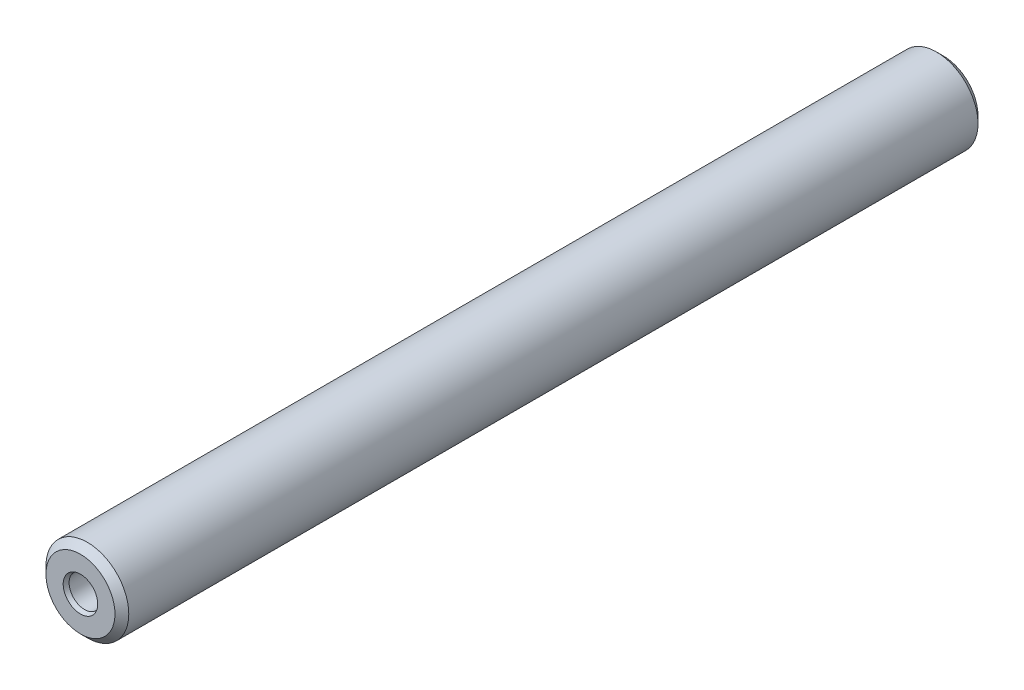
ISO-10303-21;
HEADER;
FILE_DESCRIPTION(('STEP AP214'),'2;1');
FILE_NAME('part.step','',(''),(''),'','','');
FILE_SCHEMA(('AUTOMOTIVE_DESIGN { 1 0 10303 214 1 1 1 1 }'));
ENDSEC;
DATA;
#1=APPLICATION_CONTEXT('core data for automotive mechanical design processes');
#2=APPLICATION_PROTOCOL_DEFINITION('international standard','automotive_design',2000,#1);
#3=PRODUCT_CONTEXT('',#1,'mechanical');
#4=PRODUCT('Part','Part','',(#3));
#5=PRODUCT_RELATED_PRODUCT_CATEGORY('part','',(#4));
#6=PRODUCT_DEFINITION_FORMATION('','',#4);
#7=PRODUCT_DEFINITION_CONTEXT('part definition',#1,'design');
#8=PRODUCT_DEFINITION('design','',#6,#7);
#9=PRODUCT_DEFINITION_SHAPE('','',#8);
#10=(LENGTH_UNIT() NAMED_UNIT(*) SI_UNIT(.MILLI.,.METRE.));
#11=(NAMED_UNIT(*) PLANE_ANGLE_UNIT() SI_UNIT($,.RADIAN.));
#12=(NAMED_UNIT(*) SI_UNIT($,.STERADIAN.) SOLID_ANGLE_UNIT());
#13=UNCERTAINTY_MEASURE_WITH_UNIT(LENGTH_MEASURE(1.E-05),#10,'distance_accuracy_value','');
#14=(GEOMETRIC_REPRESENTATION_CONTEXT(3) GLOBAL_UNCERTAINTY_ASSIGNED_CONTEXT((#13)) GLOBAL_UNIT_ASSIGNED_CONTEXT((#10,
#11,#12)) REPRESENTATION_CONTEXT('',''));
#15=CARTESIAN_POINT('',(0.,0.,0.));
#16=DIRECTION('',(0.,0.,1.));
#17=DIRECTION('',(1.,0.,0.));
#18=AXIS2_PLACEMENT_3D('',#15,#16,#17);
#19=CARTESIAN_POINT('',(0.,0.,125.));
#20=DIRECTION('',(0.,0.,-1.));
#21=DIRECTION('',(-1.,0.,0.));
#22=AXIS2_PLACEMENT_3D('',#19,#20,#21);
#23=CYLINDRICAL_SURFACE('',#22,6.00000000000001);
#24=CARTESIAN_POINT('',(0.,0.,0.999999999999987));
#25=DIRECTION('',(0.,0.,1.));
#26=DIRECTION('',(1.,0.,0.));
#27=AXIS2_PLACEMENT_3D('',#24,#25,#26);
#28=CIRCLE('',#27,6.00000000000001);
#29=CARTESIAN_POINT('',(6.00000000000001,0.,0.999999999999987));
#30=VERTEX_POINT('',#29);
#31=EDGE_CURVE('E77',#30,#30,#28,.T.);
#32=ORIENTED_EDGE('',*,*,#31,.T.);
#33=EDGE_LOOP('',(#32));
#34=FACE_BOUND('',#33,.T.);
#35=CARTESIAN_POINT('',(0.,0.,124.));
#36=DIRECTION('',(0.,0.,1.));
#37=DIRECTION('',(1.,0.,0.));
#38=AXIS2_PLACEMENT_3D('',#35,#36,#37);
#39=CIRCLE('',#38,6.00000000000001);
#40=CARTESIAN_POINT('',(6.00000000000001,0.,124.));
#41=VERTEX_POINT('',#40);
#42=EDGE_CURVE('E74',#41,#41,#39,.F.);
#43=ORIENTED_EDGE('',*,*,#42,.T.);
#44=EDGE_LOOP('',(#43));
#45=FACE_BOUND('',#44,.T.);
#46=ADVANCED_FACE('F34',(#34,#45),#23,.T.);
#47=CARTESIAN_POINT('',(0.,0.,125.));
#48=DIRECTION('',(0.,0.,1.));
#49=DIRECTION('',(1.,0.,0.));
#50=AXIS2_PLACEMENT_3D('',#47,#48,#49);
#51=PLANE('',#50);
#52=CARTESIAN_POINT('',(0.,0.,125.));
#53=DIRECTION('',(0.,0.,1.));
#54=DIRECTION('',(1.,0.,0.));
#55=AXIS2_PLACEMENT_3D('',#52,#53,#54);
#56=CIRCLE('',#55,2.5);
#57=CARTESIAN_POINT('',(2.5,0.,125.));
#58=VERTEX_POINT('',#57);
#59=EDGE_CURVE('E58',#58,#58,#56,.T.);
#60=ORIENTED_EDGE('',*,*,#59,.F.);
#61=EDGE_LOOP('',(#60));
#62=FACE_BOUND('',#61,.T.);
#63=CARTESIAN_POINT('',(0.,0.,125.));
#64=DIRECTION('',(0.,0.,1.));
#65=DIRECTION('',(1.,0.,0.));
#66=AXIS2_PLACEMENT_3D('',#63,#64,#65);
#67=CIRCLE('',#66,4.99999999999999);
#68=CARTESIAN_POINT('',(4.99999999999999,0.,125.));
#69=VERTEX_POINT('',#68);
#70=EDGE_CURVE('E11',#69,#69,#67,.T.);
#71=ORIENTED_EDGE('',*,*,#70,.T.);
#72=EDGE_LOOP('',(#71));
#73=FACE_BOUND('',#72,.T.);
#74=ADVANCED_FACE('F91',(#62,#73),#51,.T.);
#75=CARTESIAN_POINT('',(0.,0.,0.));
#76=DIRECTION('',(0.,0.,1.));
#77=DIRECTION('',(1.,0.,0.));
#78=AXIS2_PLACEMENT_3D('',#75,#76,#77);
#79=PLANE('',#78);
#80=CARTESIAN_POINT('',(2.00385197324238E-06,-1.85011828079951E-06,0.));
#81=DIRECTION('',(0.,0.,-1.));
#82=DIRECTION('',(-1.,0.,0.));
#83=AXIS2_PLACEMENT_3D('',#80,#81,#82);
#84=CIRCLE('',#83,2.49999799614871);
#85=CARTESIAN_POINT('',(-2.49999599229674,-1.85011828079951E-06,0.));
#86=VERTEX_POINT('',#85);
#87=EDGE_CURVE('E65',#86,#86,#84,.T.);
#88=ORIENTED_EDGE('',*,*,#87,.F.);
#89=EDGE_LOOP('',(#88));
#90=FACE_BOUND('',#89,.T.);
#91=CARTESIAN_POINT('',(0.,0.,0.));
#92=DIRECTION('',(0.,0.,1.));
#93=DIRECTION('',(1.,0.,0.));
#94=AXIS2_PLACEMENT_3D('',#91,#92,#93);
#95=CIRCLE('',#94,5.00000000000003);
#96=CARTESIAN_POINT('',(5.00000000000003,0.,0.));
#97=VERTEX_POINT('',#96);
#98=EDGE_CURVE('E42',#97,#97,#95,.F.);
#99=ORIENTED_EDGE('',*,*,#98,.T.);
#100=EDGE_LOOP('',(#99));
#101=FACE_BOUND('',#100,.T.);
#102=ADVANCED_FACE('F82',(#90,#101),#79,.F.);
#103=CARTESIAN_POINT('',(0.,0.,0.999999999999987));
#104=DIRECTION('',(0.,0.,1.));
#105=DIRECTION('',(1.,0.,0.));
#106=AXIS2_PLACEMENT_3D('',#103,#104,#105);
#107=CONICAL_SURFACE('',#106,6.00000000000001,0.785398163397441);
#108=ORIENTED_EDGE('',*,*,#98,.F.);
#109=EDGE_LOOP('',(#108));
#110=FACE_BOUND('',#109,.T.);
#111=ORIENTED_EDGE('',*,*,#31,.F.);
#112=EDGE_LOOP('',(#111));
#113=FACE_BOUND('',#112,.T.);
#114=ADVANCED_FACE('F84',(#110,#113),#107,.T.);
#115=CARTESIAN_POINT('',(0.,0.,125.));
#116=DIRECTION('',(0.,0.,-1.));
#117=DIRECTION('',(-1.,0.,0.));
#118=AXIS2_PLACEMENT_3D('',#115,#116,#117);
#119=CONICAL_SURFACE('',#118,4.99999999999999,0.785398163397455);
#120=ORIENTED_EDGE('',*,*,#42,.F.);
#121=EDGE_LOOP('',(#120));
#122=FACE_BOUND('',#121,.T.);
#123=ORIENTED_EDGE('',*,*,#70,.F.);
#124=EDGE_LOOP('',(#123));
#125=FACE_BOUND('',#124,.T.);
#126=ADVANCED_FACE('F36',(#122,#125),#119,.T.);
#127=CARTESIAN_POINT('',(0.,0.,114.));
#128=DIRECTION('',(0.,0.,1.));
#129=DIRECTION('',(1.,0.,0.));
#130=AXIS2_PLACEMENT_3D('',#127,#128,#129);
#131=CONICAL_SURFACE('',#130,2.25,1.02974425867665);
#132=CARTESIAN_POINT('',(0.,0.,112.648063607188));
#133=VERTEX_POINT('',#132);
#134=VERTEX_LOOP('',#133);
#135=FACE_BOUND('',#134,.T.);
#136=CARTESIAN_POINT('',(0.,0.,114.));
#137=DIRECTION('',(0.,0.,1.));
#138=DIRECTION('',(1.,0.,0.));
#139=AXIS2_PLACEMENT_3D('',#136,#137,#138);
#140=CIRCLE('',#139,2.25);
#141=CARTESIAN_POINT('',(2.25,0.,114.));
#142=VERTEX_POINT('',#141);
#143=EDGE_CURVE('E71',#142,#142,#140,.T.);
#144=ORIENTED_EDGE('',*,*,#143,.T.);
#145=EDGE_LOOP('',(#144));
#146=FACE_BOUND('',#145,.T.);
#147=ADVANCED_FACE('F97',(#135,#146),#131,.F.);
#148=CARTESIAN_POINT('',(0.,0.,125.));
#149=DIRECTION('',(0.,0.,1.));
#150=DIRECTION('',(1.,0.,0.));
#151=AXIS2_PLACEMENT_3D('',#148,#149,#150);
#152=CYLINDRICAL_SURFACE('',#151,2.25);
#153=ORIENTED_EDGE('',*,*,#143,.F.);
#154=EDGE_LOOP('',(#153));
#155=FACE_BOUND('',#154,.T.);
#156=CARTESIAN_POINT('',(0.,0.,124.396446609407));
#157=DIRECTION('',(0.,0.,1.));
#158=DIRECTION('',(1.,0.,0.));
#159=AXIS2_PLACEMENT_3D('',#156,#157,#158);
#160=CIRCLE('',#159,2.25);
#161=CARTESIAN_POINT('',(2.25,0.,124.396446609407));
#162=VERTEX_POINT('',#161);
#163=EDGE_CURVE('E62',#162,#162,#160,.T.);
#164=ORIENTED_EDGE('',*,*,#163,.T.);
#165=EDGE_LOOP('',(#164));
#166=FACE_BOUND('',#165,.T.);
#167=ADVANCED_FACE('F112',(#155,#166),#152,.F.);
#168=CARTESIAN_POINT('',(0.,0.,125.));
#169=DIRECTION('',(0.,0.,1.));
#170=DIRECTION('',(1.,0.,0.));
#171=AXIS2_PLACEMENT_3D('',#168,#169,#170);
#172=CONICAL_SURFACE('',#171,2.5,0.392699081698726);
#173=ORIENTED_EDGE('',*,*,#163,.F.);
#174=EDGE_LOOP('',(#173));
#175=FACE_BOUND('',#174,.T.);
#176=ORIENTED_EDGE('',*,*,#59,.T.);
#177=EDGE_LOOP('',(#176));
#178=FACE_BOUND('',#177,.T.);
#179=ADVANCED_FACE('F52',(#175,#178),#172,.F.);
#180=CARTESIAN_POINT('',(2.00385197324238E-06,-1.85011828079951E-06,11.));
#181=DIRECTION('',(0.,0.,-1.));
#182=DIRECTION('',(-1.,0.,0.));
#183=AXIS2_PLACEMENT_3D('',#180,#181,#182);
#184=CONICAL_SURFACE('',#183,2.24999799614878,1.02974333036629);
#185=CARTESIAN_POINT('',(0.,0.,12.351936392812));
#186=VERTEX_POINT('',#185);
#187=VERTEX_LOOP('',#186);
#188=FACE_BOUND('',#187,.T.);
#189=CARTESIAN_POINT('',(2.00385197324238E-06,-1.85011828079951E-06,11.));
#190=DIRECTION('',(0.,0.,-1.));
#191=DIRECTION('',(-1.,0.,0.));
#192=AXIS2_PLACEMENT_3D('',#189,#190,#191);
#193=CIRCLE('',#192,2.24999799614878);
#194=CARTESIAN_POINT('',(-2.2499959922968,-1.85011828079951E-06,11.));
#195=VERTEX_POINT('',#194);
#196=EDGE_CURVE('E56',#195,#195,#193,.T.);
#197=ORIENTED_EDGE('',*,*,#196,.T.);
#198=EDGE_LOOP('',(#197));
#199=FACE_BOUND('',#198,.T.);
#200=ADVANCED_FACE('F48',(#188,#199),#184,.F.);
#201=CARTESIAN_POINT('',(2.00385197324238E-06,-1.85011828079951E-06,0.));
#202=DIRECTION('',(0.,0.,-1.));
#203=DIRECTION('',(-1.,0.,0.));
#204=AXIS2_PLACEMENT_3D('',#201,#202,#203);
#205=CYLINDRICAL_SURFACE('',#204,2.24999799614878);
#206=ORIENTED_EDGE('',*,*,#196,.F.);
#207=EDGE_LOOP('',(#206));
#208=FACE_BOUND('',#207,.T.);
#209=CARTESIAN_POINT('',(2.00385197324238E-06,-1.85011828079951E-06,0.6035533905933));
#210=DIRECTION('',(0.,0.,-1.));
#211=DIRECTION('',(-1.,0.,0.));
#212=AXIS2_PLACEMENT_3D('',#209,#210,#211);
#213=CIRCLE('',#212,2.24999799614878);
#214=CARTESIAN_POINT('',(-2.2499959922968,-1.85011828079951E-06,0.6035533905933));
#215=VERTEX_POINT('',#214);
#216=EDGE_CURVE('E59',#215,#215,#213,.T.);
#217=ORIENTED_EDGE('',*,*,#216,.T.);
#218=EDGE_LOOP('',(#217));
#219=FACE_BOUND('',#218,.T.);
#220=ADVANCED_FACE('F51',(#208,#219),#205,.F.);
#221=CARTESIAN_POINT('',(2.00385197324238E-06,-1.85011828079951E-06,0.));
#222=DIRECTION('',(0.,0.,-1.));
#223=DIRECTION('',(-1.,0.,0.));
#224=AXIS2_PLACEMENT_3D('',#221,#222,#223);
#225=CONICAL_SURFACE('',#224,2.49999799614871,0.392699081698615);
#226=ORIENTED_EDGE('',*,*,#216,.F.);
#227=EDGE_LOOP('',(#226));
#228=FACE_BOUND('',#227,.T.);
#229=ORIENTED_EDGE('',*,*,#87,.T.);
#230=EDGE_LOOP('',(#229));
#231=FACE_BOUND('',#230,.T.);
#232=ADVANCED_FACE('F121',(#228,#231),#225,.F.);
#233=CLOSED_SHELL('',(#46,#74,#102,#114,#126,#147,#167,#179,#200,#220,#232));
#234=MANIFOLD_SOLID_BREP('B2',#233);
#235=ADVANCED_BREP_SHAPE_REPRESENTATION('',(#18,#234),#14);
#236=SHAPE_DEFINITION_REPRESENTATION(#9,#235);
ENDSEC;
END-ISO-10303-21;
